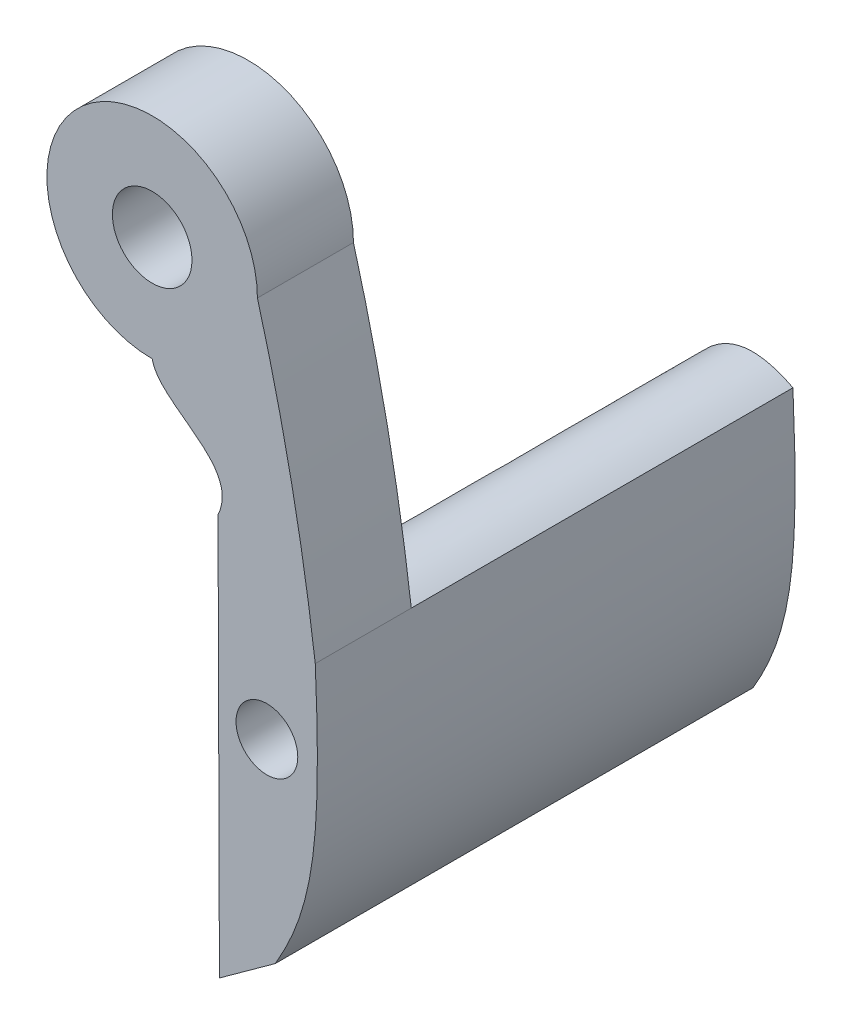
ISO-10303-21;
HEADER;
FILE_DESCRIPTION(('STEP AP214'),'2;1');
FILE_NAME('part.step','',(''),(''),'','','');
FILE_SCHEMA(('AUTOMOTIVE_DESIGN { 1 0 10303 214 1 1 1 1 }'));
ENDSEC;
DATA;
#1=APPLICATION_CONTEXT('core data for automotive mechanical design processes');
#2=APPLICATION_PROTOCOL_DEFINITION('international standard','automotive_design',2000,#1);
#3=PRODUCT_CONTEXT('',#1,'mechanical');
#4=PRODUCT('Part','Part','',(#3));
#5=PRODUCT_RELATED_PRODUCT_CATEGORY('part','',(#4));
#6=PRODUCT_DEFINITION_FORMATION('','',#4);
#7=PRODUCT_DEFINITION_CONTEXT('part definition',#1,'design');
#8=PRODUCT_DEFINITION('design','',#6,#7);
#9=PRODUCT_DEFINITION_SHAPE('','',#8);
#10=(LENGTH_UNIT() NAMED_UNIT(*) SI_UNIT(.MILLI.,.METRE.));
#11=(NAMED_UNIT(*) PLANE_ANGLE_UNIT() SI_UNIT($,.RADIAN.));
#12=(NAMED_UNIT(*) SI_UNIT($,.STERADIAN.) SOLID_ANGLE_UNIT());
#13=UNCERTAINTY_MEASURE_WITH_UNIT(LENGTH_MEASURE(1.E-05),#10,'distance_accuracy_value','');
#14=(GEOMETRIC_REPRESENTATION_CONTEXT(3) GLOBAL_UNCERTAINTY_ASSIGNED_CONTEXT((#13)) GLOBAL_UNIT_ASSIGNED_CONTEXT((#10,
#11,#12)) REPRESENTATION_CONTEXT('',''));
#15=CARTESIAN_POINT('',(0.,0.,0.));
#16=DIRECTION('',(0.,0.,1.));
#17=DIRECTION('',(1.,0.,0.));
#18=AXIS2_PLACEMENT_3D('',#15,#16,#17);
#19=CARTESIAN_POINT('',(23.5830831343586,-50.6621029570982,-7.));
#20=DIRECTION('',(-0.999993998212447,-0.00346461240021393,0.));
#21=DIRECTION('',(0.00346461240021393,-0.999993998212447,0.));
#22=AXIS2_PLACEMENT_3D('',#19,#20,#21);
#23=PLANE('',#22);
#24=DIRECTION('',(0.00346461240021393,-0.999993998212447,0.));
#25=VECTOR('',#24,1.);
#26=CARTESIAN_POINT('',(23.5830831343586,-50.6621029570982,0.));
#27=LINE('',#26,#25);
#28=CARTESIAN_POINT('',(23.5830831343586,-50.6621029570982,0.));
#29=VERTEX_POINT('',#28);
#30=CARTESIAN_POINT('',(23.6842225641709,-79.8540618581353,0.));
#31=VERTEX_POINT('',#30);
#32=EDGE_CURVE('E156',#29,#31,#27,.T.);
#33=ORIENTED_EDGE('',*,*,#32,.F.);
#34=DIRECTION('',(0.,0.,1.));
#35=VECTOR('',#34,1.);
#36=CARTESIAN_POINT('',(23.5830831343586,-50.6621029570982,-7.));
#37=LINE('',#36,#35);
#38=CARTESIAN_POINT('',(23.5830831343586,-50.6621029570982,-7.));
#39=VERTEX_POINT('',#38);
#40=EDGE_CURVE('E11',#39,#29,#37,.T.);
#41=ORIENTED_EDGE('',*,*,#40,.F.);
#42=DIRECTION('',(0.00346461240020755,-0.999993998212447,0.));
#43=VECTOR('',#42,1.);
#44=CARTESIAN_POINT('',(23.6086615825674,-58.0448320297016,-7.));
#45=LINE('',#44,#43);
#46=CARTESIAN_POINT('',(23.6086615825711,-58.0448320307762,-7.));
#47=VERTEX_POINT('',#46);
#48=EDGE_CURVE('E65',#39,#47,#45,.T.);
#49=ORIENTED_EDGE('',*,*,#48,.T.);
#50=DIRECTION('',(0.,0.,1.));
#51=VECTOR('',#50,1.);
#52=CARTESIAN_POINT('',(23.6086615818498,-58.0448320307828,-34.812432));
#53=LINE('',#52,#51);
#54=CARTESIAN_POINT('',(23.6086615818498,-58.0448320307828,-34.812432));
#55=VERTEX_POINT('',#54);
#56=EDGE_CURVE('E118',#55,#47,#53,.T.);
#57=ORIENTED_EDGE('',*,*,#56,.F.);
#58=DIRECTION('',(-0.00346461240020755,0.999993998212447,0.));
#59=VECTOR('',#58,1.);
#60=CARTESIAN_POINT('',(23.6842225641709,-79.8540618581353,-34.812432));
#61=LINE('',#60,#59);
#62=CARTESIAN_POINT('',(23.6842225641709,-79.8540618581353,-34.812432));
#63=VERTEX_POINT('',#62);
#64=EDGE_CURVE('E126',#63,#55,#61,.T.);
#65=ORIENTED_EDGE('',*,*,#64,.F.);
#66=DIRECTION('',(0.,0.,1.));
#67=VECTOR('',#66,1.);
#68=CARTESIAN_POINT('',(23.6842225641709,-79.8540618581353,-7.));
#69=LINE('',#68,#67);
#70=EDGE_CURVE('E46',#63,#31,#69,.T.);
#71=ORIENTED_EDGE('',*,*,#70,.T.);
#72=EDGE_LOOP('',(#33,#41,#49,#57,#65,#71));
#73=FACE_BOUND('',#72,.T.);
#74=ADVANCED_FACE('F42',(#73),#23,.T.);
#75=CARTESIAN_POINT('',(18.7830331394304,-43.2252481779718,-7.));
#76=CARTESIAN_POINT('',(19.3227725840483,-45.8172283218555,-7.));
#77=CARTESIAN_POINT('',(25.2940823387529,-46.9405897101704,-7.));
#78=CARTESIAN_POINT('',(23.5830831343586,-50.6621029570982,-7.));
#79=B_SPLINE_CURVE_WITH_KNOTS('',3,(#75,#76,#77,#78),.UNSPECIFIED.,.F.,.F.,(4,4),(0.,1.),.UNSPECIFIED.);
#80=DIRECTION('',(0.,0.,1.));
#81=VECTOR('',#80,1.);
#82=SURFACE_OF_LINEAR_EXTRUSION('',#79,#81);
#83=CARTESIAN_POINT('',(18.7830331394304,-43.2252481779718,0.));
#84=CARTESIAN_POINT('',(19.3227725840483,-45.8172283218555,0.));
#85=CARTESIAN_POINT('',(25.2940823387529,-46.9405897101704,0.));
#86=CARTESIAN_POINT('',(23.5830831343586,-50.6621029570982,0.));
#87=B_SPLINE_CURVE_WITH_KNOTS('',3,(#83,#84,#85,#86),.UNSPECIFIED.,.F.,.F.,(4,4),(0.,1.),.UNSPECIFIED.);
#88=CARTESIAN_POINT('',(18.7830331394305,-43.2252481779718,0.));
#89=VERTEX_POINT('',#88);
#90=EDGE_CURVE('E219',#89,#29,#87,.T.);
#91=ORIENTED_EDGE('',*,*,#90,.F.);
#92=DIRECTION('',(0.,0.,1.));
#93=VECTOR('',#92,1.);
#94=CARTESIAN_POINT('',(18.7830331394305,-43.2252481779718,-7.));
#95=LINE('',#94,#93);
#96=CARTESIAN_POINT('',(18.7830331394305,-43.2252481779718,-7.));
#97=VERTEX_POINT('',#96);
#98=EDGE_CURVE('E52',#97,#89,#95,.T.);
#99=ORIENTED_EDGE('',*,*,#98,.F.);
#100=EDGE_CURVE('E184',#97,#39,#79,.T.);
#101=ORIENTED_EDGE('',*,*,#100,.T.);
#102=ORIENTED_EDGE('',*,*,#40,.T.);
#103=EDGE_LOOP('',(#91,#99,#101,#102));
#104=FACE_BOUND('',#103,.T.);
#105=ADVANCED_FACE('F179',(#104),#82,.T.);
#106=CARTESIAN_POINT('',(18.7830331394305,-35.55478648582,-7.));
#107=DIRECTION('',(0.,0.,1.));
#108=DIRECTION('',(1.,0.,0.));
#109=AXIS2_PLACEMENT_3D('',#106,#107,#108);
#110=CYLINDRICAL_SURFACE('',#109,7.67046169215176);
#111=CARTESIAN_POINT('',(18.7830331394305,-35.55478648582,0.));
#112=DIRECTION('',(0.,0.,1.));
#113=DIRECTION('',(1.,0.,0.));
#114=AXIS2_PLACEMENT_3D('',#111,#112,#113);
#115=CIRCLE('',#114,7.67046169215176);
#116=CARTESIAN_POINT('',(26.4534948315822,-35.55478648582,0.));
#117=VERTEX_POINT('',#116);
#118=EDGE_CURVE('E212',#117,#89,#115,.T.);
#119=ORIENTED_EDGE('',*,*,#118,.F.);
#120=DIRECTION('',(0.,0.,1.));
#121=VECTOR('',#120,1.);
#122=CARTESIAN_POINT('',(26.4534948315822,-35.55478648582,-7.));
#123=LINE('',#122,#121);
#124=CARTESIAN_POINT('',(26.4534948315822,-35.55478648582,-7.));
#125=VERTEX_POINT('',#124);
#126=EDGE_CURVE('E96',#125,#117,#123,.T.);
#127=ORIENTED_EDGE('',*,*,#126,.F.);
#128=CARTESIAN_POINT('',(18.7830331394305,-35.55478648582,-7.));
#129=DIRECTION('',(0.,0.,1.));
#130=DIRECTION('',(1.,0.,0.));
#131=AXIS2_PLACEMENT_3D('',#128,#129,#130);
#132=CIRCLE('',#131,7.67046169215176);
#133=EDGE_CURVE('E190',#125,#97,#132,.T.);
#134=ORIENTED_EDGE('',*,*,#133,.T.);
#135=ORIENTED_EDGE('',*,*,#98,.T.);
#136=EDGE_LOOP('',(#119,#127,#134,#135));
#137=FACE_BOUND('',#136,.T.);
#138=ADVANCED_FACE('F175',(#137),#110,.T.);
#139=CARTESIAN_POINT('',(30.6680595779187,-56.5170898812196,-7.));
#140=CARTESIAN_POINT('',(29.3204289813708,-45.883744030394,-7.));
#141=CARTESIAN_POINT('',(26.4534948315822,-35.55478648582,-7.));
#142=B_SPLINE_CURVE_WITH_KNOTS('',2,(#139,#140,#141),.UNSPECIFIED.,.F.,.F.,(3,3),(0.,1.),.UNSPECIFIED.);
#143=DIRECTION('',(0.,0.,1.));
#144=VECTOR('',#143,1.);
#145=SURFACE_OF_LINEAR_EXTRUSION('',#142,#144);
#146=CARTESIAN_POINT('',(30.6680595779187,-56.5170898812196,0.));
#147=CARTESIAN_POINT('',(29.3204289813708,-45.883744030394,0.));
#148=CARTESIAN_POINT('',(26.4534948315822,-35.55478648582,0.));
#149=B_SPLINE_CURVE_WITH_KNOTS('',2,(#146,#147,#148),.UNSPECIFIED.,.F.,.F.,(3,3),(0.,1.),.UNSPECIFIED.);
#150=CARTESIAN_POINT('',(30.6680595779187,-56.5170898812196,0.));
#151=VERTEX_POINT('',#150);
#152=EDGE_CURVE('E203',#151,#117,#149,.T.);
#153=ORIENTED_EDGE('',*,*,#152,.F.);
#154=DIRECTION('',(0.,0.,1.));
#155=VECTOR('',#154,1.);
#156=CARTESIAN_POINT('',(30.6680595779187,-56.5170898812196,-7.));
#157=LINE('',#156,#155);
#158=CARTESIAN_POINT('',(30.668059577541,-56.5170898810181,-7.));
#159=VERTEX_POINT('',#158);
#160=EDGE_CURVE('E233',#159,#151,#157,.T.);
#161=ORIENTED_EDGE('',*,*,#160,.F.);
#162=EDGE_CURVE('E155',#159,#125,#142,.T.);
#163=ORIENTED_EDGE('',*,*,#162,.T.);
#164=ORIENTED_EDGE('',*,*,#126,.T.);
#165=EDGE_LOOP('',(#153,#161,#163,#164));
#166=FACE_BOUND('',#165,.T.);
#167=ADVANCED_FACE('F171',(#166),#145,.T.);
#168=CARTESIAN_POINT('',(27.7516650240297,-76.9116141942992,-7.));
#169=CARTESIAN_POINT('',(30.6656126513569,-71.9964375748199,-7.));
#170=CARTESIAN_POINT('',(31.1321794796414,-67.2565321556517,-7.));
#171=CARTESIAN_POINT('',(30.6680595779187,-56.5170898812196,-7.));
#172=B_SPLINE_CURVE_WITH_KNOTS('',3,(#168,#169,#170,#171),.UNSPECIFIED.,.F.,.F.,(4,4),
(0.222415534740242,0.766682964721302),.UNSPECIFIED.);
#173=DIRECTION('',(0.,0.,1.));
#174=VECTOR('',#173,1.);
#175=SURFACE_OF_LINEAR_EXTRUSION('',#172,#174);
#176=CARTESIAN_POINT('',(27.7516650240297,-76.9116141942992,0.));
#177=CARTESIAN_POINT('',(30.6656126513569,-71.9964375748199,0.));
#178=CARTESIAN_POINT('',(31.1321794796414,-67.2565321556517,0.));
#179=CARTESIAN_POINT('',(30.6680595779187,-56.5170898812196,0.));
#180=B_SPLINE_CURVE_WITH_KNOTS('',3,(#176,#177,#178,#179),.UNSPECIFIED.,.F.,.F.,(4,4),
(0.222415534740242,0.766682964721302),.UNSPECIFIED.);
#181=CARTESIAN_POINT('',(27.7516650240297,-76.9116141942992,0.));
#182=VERTEX_POINT('',#181);
#183=EDGE_CURVE('E197',#182,#151,#180,.T.);
#184=ORIENTED_EDGE('',*,*,#183,.F.);
#185=DIRECTION('',(0.,0.,1.));
#186=VECTOR('',#185,1.);
#187=CARTESIAN_POINT('',(27.7516650240297,-76.9116141942992,-7.));
#188=LINE('',#187,#186);
#189=CARTESIAN_POINT('',(27.7516650240297,-76.9116141942992,-34.812432));
#190=VERTEX_POINT('',#189);
#191=EDGE_CURVE('E235',#190,#182,#188,.T.);
#192=ORIENTED_EDGE('',*,*,#191,.F.);
#193=CARTESIAN_POINT('',(30.668059577541,-56.5170898810181,-34.812432));
#194=CARTESIAN_POINT('',(31.1321794794735,-67.2565321554411,-34.812432));
#195=CARTESIAN_POINT('',(30.6656126512816,-71.9964375746184,-34.812432));
#196=CARTESIAN_POINT('',(27.7516650240504,-76.9116141941546,-34.812432));
#197=B_SPLINE_CURVE_WITH_KNOTS('',3,(#193,#194,#195,#196),.UNSPECIFIED.,.F.,.F.,(4,4),
(0.222415534740242,0.766682964721302),.UNSPECIFIED.);
#198=CARTESIAN_POINT('',(30.668059577541,-56.5170898810181,-34.812432));
#199=VERTEX_POINT('',#198);
#200=EDGE_CURVE('E125',#199,#190,#197,.T.);
#201=ORIENTED_EDGE('',*,*,#200,.F.);
#202=DIRECTION('',(0.,0.,1.));
#203=VECTOR('',#202,1.);
#204=CARTESIAN_POINT('',(30.668059577541,-56.5170898810181,-34.812432));
#205=LINE('',#204,#203);
#206=EDGE_CURVE('E120',#199,#159,#205,.T.);
#207=ORIENTED_EDGE('',*,*,#206,.T.);
#208=ORIENTED_EDGE('',*,*,#160,.T.);
#209=EDGE_LOOP('',(#184,#192,#201,#207,#208));
#210=FACE_BOUND('',#209,.T.);
#211=ADVANCED_FACE('F168',(#210),#175,.T.);
#212=CARTESIAN_POINT('',(23.6842225641709,-79.8540618581353,-7.));
#213=DIRECTION('',(0.586125341437605,-0.810220392315974,0.));
#214=DIRECTION('',(0.810220392315974,0.586125341437605,0.));
#215=AXIS2_PLACEMENT_3D('',#212,#213,#214);
#216=PLANE('',#215);
#217=DIRECTION('',(0.810220392315974,0.586125341437605,0.));
#218=VECTOR('',#217,1.);
#219=CARTESIAN_POINT('',(23.6842225641709,-79.8540618581353,0.));
#220=LINE('',#219,#218);
#221=EDGE_CURVE('E151',#31,#182,#220,.T.);
#222=ORIENTED_EDGE('',*,*,#221,.F.);
#223=ORIENTED_EDGE('',*,*,#70,.F.);
#224=DIRECTION('',(-0.810220392315974,-0.586125341437605,0.));
#225=VECTOR('',#224,1.);
#226=CARTESIAN_POINT('',(27.7516650240297,-76.9116141942992,-34.812432));
#227=LINE('',#226,#225);
#228=EDGE_CURVE('E132',#190,#63,#227,.T.);
#229=ORIENTED_EDGE('',*,*,#228,.F.);
#230=ORIENTED_EDGE('',*,*,#191,.T.);
#231=EDGE_LOOP('',(#222,#223,#229,#230));
#232=FACE_BOUND('',#231,.T.);
#233=ADVANCED_FACE('F44',(#232),#216,.T.);
#234=CARTESIAN_POINT('',(30.4766376243679,-68.8984516583667,-7.));
#235=DIRECTION('',(0.,0.,-1.));
#236=DIRECTION('',(-1.,0.,0.));
#237=AXIS2_PLACEMENT_3D('',#234,#235,#236);
#238=PLANE('',#237);
#239=CARTESIAN_POINT('',(225947.817454841,-974205.853876003,-7.));
#240=CARTESIAN_POINT('',(-228752.664459082,973422.471229088,-7.));
#241=CARTESIAN_POINT('',(231664.383204436,-972862.390558936,-7.));
#242=B_SPLINE_CURVE_WITH_KNOTS('',2,(#239,#240,#241),.UNSPECIFIED.,.F.,.F.,(3,3),(0.,1.),.UNSPECIFIED.);
#243=EDGE_CURVE('E60',#47,#159,#242,.T.);
#244=ORIENTED_EDGE('',*,*,#243,.F.);
#245=ORIENTED_EDGE('',*,*,#48,.F.);
#246=ORIENTED_EDGE('',*,*,#100,.F.);
#247=ORIENTED_EDGE('',*,*,#133,.F.);
#248=ORIENTED_EDGE('',*,*,#162,.F.);
#249=EDGE_LOOP('',(#244,#245,#246,#247,#248));
#250=FACE_BOUND('',#249,.T.);
#251=CARTESIAN_POINT('',(18.7830331394305,-35.55478648582,-7.));
#252=DIRECTION('',(0.,0.,1.));
#253=DIRECTION('',(1.,0.,0.));
#254=AXIS2_PLACEMENT_3D('',#251,#252,#253);
#255=CIRCLE('',#254,2.9);
#256=CARTESIAN_POINT('',(21.6830331394304,-35.55478648582,-7.));
#257=VERTEX_POINT('',#256);
#258=EDGE_CURVE('E144',#257,#257,#255,.T.);
#259=ORIENTED_EDGE('',*,*,#258,.T.);
#260=EDGE_LOOP('',(#259));
#261=FACE_BOUND('',#260,.T.);
#262=ADVANCED_FACE('F243',(#250,#261),#238,.T.);
#263=CARTESIAN_POINT('',(30.4766376243679,-68.8984516583667,0.));
#264=DIRECTION('',(0.,0.,-1.));
#265=DIRECTION('',(-1.,0.,0.));
#266=AXIS2_PLACEMENT_3D('',#263,#264,#265);
#267=PLANE('',#266);
#268=CARTESIAN_POINT('',(27.1437232414781,-63.0556717115034,0.));
#269=DIRECTION('',(0.,0.,1.));
#270=DIRECTION('',(1.,0.,0.));
#271=AXIS2_PLACEMENT_3D('',#268,#269,#270);
#272=CIRCLE('',#271,2.25);
#273=CARTESIAN_POINT('',(29.3937232414781,-63.0556717115034,0.));
#274=VERTEX_POINT('',#273);
#275=EDGE_CURVE('E406',#274,#274,#272,.T.);
#276=ORIENTED_EDGE('',*,*,#275,.F.);
#277=EDGE_LOOP('',(#276));
#278=FACE_BOUND('',#277,.T.);
#279=CARTESIAN_POINT('',(18.7830331394305,-35.55478648582,0.));
#280=DIRECTION('',(0.,0.,1.));
#281=DIRECTION('',(1.,0.,0.));
#282=AXIS2_PLACEMENT_3D('',#279,#280,#281);
#283=CIRCLE('',#282,2.9);
#284=CARTESIAN_POINT('',(21.6830331394304,-35.55478648582,0.));
#285=VERTEX_POINT('',#284);
#286=EDGE_CURVE('E139',#285,#285,#283,.T.);
#287=ORIENTED_EDGE('',*,*,#286,.F.);
#288=EDGE_LOOP('',(#287));
#289=FACE_BOUND('',#288,.T.);
#290=ORIENTED_EDGE('',*,*,#32,.T.);
#291=ORIENTED_EDGE('',*,*,#221,.T.);
#292=ORIENTED_EDGE('',*,*,#183,.T.);
#293=ORIENTED_EDGE('',*,*,#152,.T.);
#294=ORIENTED_EDGE('',*,*,#118,.T.);
#295=ORIENTED_EDGE('',*,*,#90,.T.);
#296=EDGE_LOOP('',(#290,#291,#292,#293,#294,#295));
#297=FACE_BOUND('',#296,.T.);
#298=ADVANCED_FACE('F242',(#278,#289,#297),#267,.F.);
#299=CARTESIAN_POINT('',(18.7830331394305,-35.55478648582,-7.));
#300=DIRECTION('',(0.,0.,1.));
#301=DIRECTION('',(1.,0.,0.));
#302=AXIS2_PLACEMENT_3D('',#299,#300,#301);
#303=CYLINDRICAL_SURFACE('',#302,2.9);
#304=ORIENTED_EDGE('',*,*,#258,.F.);
#305=EDGE_LOOP('',(#304));
#306=FACE_BOUND('',#305,.T.);
#307=ORIENTED_EDGE('',*,*,#286,.T.);
#308=EDGE_LOOP('',(#307));
#309=FACE_BOUND('',#308,.T.);
#310=ADVANCED_FACE('F277',(#306,#309),#303,.F.);
#311=CARTESIAN_POINT('',(225947.817454841,-974205.853876003,-34.812432));
#312=CARTESIAN_POINT('',(-228752.664459082,973422.471229088,-34.812432));
#313=CARTESIAN_POINT('',(231664.383204436,-972862.390558936,-34.812432));
#314=B_SPLINE_CURVE_WITH_KNOTS('',2,(#311,#312,#313),.UNSPECIFIED.,.F.,.F.,(3,3),(0.,1.),.UNSPECIFIED.);
#315=DIRECTION('',(0.,0.,1.));
#316=VECTOR('',#315,1.);
#317=SURFACE_OF_LINEAR_EXTRUSION('',#314,#316);
#318=ORIENTED_EDGE('',*,*,#243,.T.);
#319=ORIENTED_EDGE('',*,*,#206,.F.);
#320=EDGE_CURVE('E114',#55,#199,#314,.T.);
#321=ORIENTED_EDGE('',*,*,#320,.F.);
#322=ORIENTED_EDGE('',*,*,#56,.T.);
#323=EDGE_LOOP('',(#318,#319,#321,#322));
#324=FACE_BOUND('',#323,.T.);
#325=ADVANCED_FACE('F116',(#324),#317,.F.);
#326=CARTESIAN_POINT('',(26.7179352781568,-55.8254941907421,-34.812432));
#327=DIRECTION('',(0.,0.,1.));
#328=DIRECTION('',(1.,0.,0.));
#329=AXIS2_PLACEMENT_3D('',#326,#327,#328);
#330=PLANE('',#329);
#331=CARTESIAN_POINT('',(27.1437232414781,-63.0556717115034,-34.812432));
#332=DIRECTION('',(0.,0.,1.));
#333=DIRECTION('',(1.,0.,0.));
#334=AXIS2_PLACEMENT_3D('',#331,#332,#333);
#335=CIRCLE('',#334,2.25);
#336=CARTESIAN_POINT('',(29.3937232414781,-63.0556717115034,-34.812432));
#337=VERTEX_POINT('',#336);
#338=EDGE_CURVE('E251',#337,#337,#335,.T.);
#339=ORIENTED_EDGE('',*,*,#338,.T.);
#340=EDGE_LOOP('',(#339));
#341=FACE_BOUND('',#340,.T.);
#342=ORIENTED_EDGE('',*,*,#64,.T.);
#343=ORIENTED_EDGE('',*,*,#320,.T.);
#344=ORIENTED_EDGE('',*,*,#200,.T.);
#345=ORIENTED_EDGE('',*,*,#228,.T.);
#346=EDGE_LOOP('',(#342,#343,#344,#345));
#347=FACE_BOUND('',#346,.T.);
#348=ADVANCED_FACE('F130',(#341,#347),#330,.F.);
#349=CARTESIAN_POINT('',(27.1437232414781,-63.0556717115034,-34.812432));
#350=DIRECTION('',(0.,0.,1.));
#351=DIRECTION('',(1.,0.,0.));
#352=AXIS2_PLACEMENT_3D('',#349,#350,#351);
#353=CYLINDRICAL_SURFACE('',#352,2.25);
#354=ORIENTED_EDGE('',*,*,#338,.F.);
#355=EDGE_LOOP('',(#354));
#356=FACE_BOUND('',#355,.T.);
#357=ORIENTED_EDGE('',*,*,#275,.T.);
#358=EDGE_LOOP('',(#357));
#359=FACE_BOUND('',#358,.T.);
#360=ADVANCED_FACE('F342',(#356,#359),#353,.F.);
#361=CLOSED_SHELL('',(#74,#105,#138,#167,#211,#233,#262,#298,#310,#325,#348,#360));
#362=MANIFOLD_SOLID_BREP('B2',#361);
#363=ADVANCED_BREP_SHAPE_REPRESENTATION('',(#18,#362),#14);
#364=SHAPE_DEFINITION_REPRESENTATION(#9,#363);
ENDSEC;
END-ISO-10303-21;
